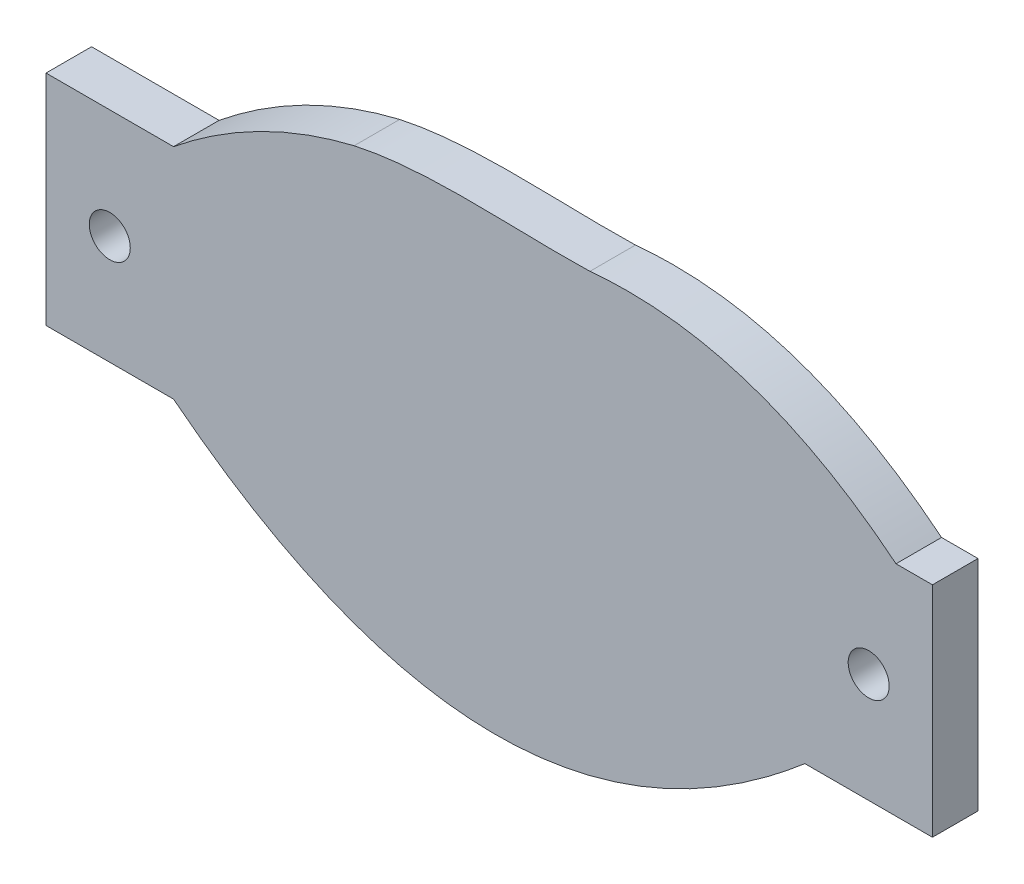
ISO-10303-21;
HEADER;
FILE_DESCRIPTION(('STEP AP214'),'2;1');
FILE_NAME('part.step','',(''),(''),'','','');
FILE_SCHEMA(('AUTOMOTIVE_DESIGN { 1 0 10303 214 1 1 1 1 }'));
ENDSEC;
DATA;
#1=APPLICATION_CONTEXT('core data for automotive mechanical design processes');
#2=APPLICATION_PROTOCOL_DEFINITION('international standard','automotive_design',2000,#1);
#3=PRODUCT_CONTEXT('',#1,'mechanical');
#4=PRODUCT('Part','Part','',(#3));
#5=PRODUCT_RELATED_PRODUCT_CATEGORY('part','',(#4));
#6=PRODUCT_DEFINITION_FORMATION('','',#4);
#7=PRODUCT_DEFINITION_CONTEXT('part definition',#1,'design');
#8=PRODUCT_DEFINITION('design','',#6,#7);
#9=PRODUCT_DEFINITION_SHAPE('','',#8);
#10=(LENGTH_UNIT() NAMED_UNIT(*) SI_UNIT(.MILLI.,.METRE.));
#11=(NAMED_UNIT(*) PLANE_ANGLE_UNIT() SI_UNIT($,.RADIAN.));
#12=(NAMED_UNIT(*) SI_UNIT($,.STERADIAN.) SOLID_ANGLE_UNIT());
#13=UNCERTAINTY_MEASURE_WITH_UNIT(LENGTH_MEASURE(1.E-05),#10,'distance_accuracy_value','');
#14=(GEOMETRIC_REPRESENTATION_CONTEXT(3) GLOBAL_UNCERTAINTY_ASSIGNED_CONTEXT((#13)) GLOBAL_UNIT_ASSIGNED_CONTEXT((#10,
#11,#12)) REPRESENTATION_CONTEXT('',''));
#15=CARTESIAN_POINT('',(0.,0.,0.));
#16=DIRECTION('',(0.,0.,1.));
#17=DIRECTION('',(1.,0.,0.));
#18=AXIS2_PLACEMENT_3D('',#15,#16,#17);
#19=CARTESIAN_POINT('',(42.3737110695465,-26.2176725913239,-5.));
#20=DIRECTION('',(0.,0.,1.));
#21=DIRECTION('',(-1.,0.,0.));
#22=AXIS2_PLACEMENT_3D('',#19,#20,#21);
#23=PLANE('',#22);
#24=DIRECTION('',(0.,-1.,0.));
#25=VECTOR('',#24,1.);
#26=CARTESIAN_POINT('',(-7.,12.,-5.));
#27=LINE('',#26,#25);
#28=CARTESIAN_POINT('',(-7.,12.,-5.));
#29=VERTEX_POINT('',#28);
#30=CARTESIAN_POINT('',(-7.,-12.,-5.));
#31=VERTEX_POINT('',#30);
#32=EDGE_CURVE('E241',#29,#31,#27,.T.);
#33=ORIENTED_EDGE('',*,*,#32,.F.);
#34=DIRECTION('',(-1.,0.,0.));
#35=VECTOR('',#34,1.);
#36=CARTESIAN_POINT('',(7.,12.,-5.));
#37=LINE('',#36,#35);
#38=CARTESIAN_POINT('',(7.,12.,-5.));
#39=VERTEX_POINT('',#38);
#40=EDGE_CURVE('E141',#39,#29,#37,.T.);
#41=ORIENTED_EDGE('',*,*,#40,.F.);
#42=CARTESIAN_POINT('',(26.825,22.,-5.));
#43=CARTESIAN_POINT('',(16.1529989573886,19.4342453643305,-5.));
#44=CARTESIAN_POINT('',(7.,12.,-5.));
#45=B_SPLINE_CURVE_WITH_KNOTS('',2,(#42,#43,#44),.UNSPECIFIED.,.F.,.F.,(3,3),(0.,
0.53349915690995),.UNSPECIFIED.);
#46=CARTESIAN_POINT('',(26.825,22.,-5.));
#47=VERTEX_POINT('',#46);
#48=EDGE_CURVE('E122',#47,#39,#45,.T.);
#49=ORIENTED_EDGE('',*,*,#48,.F.);
#50=CARTESIAN_POINT('',(52.7027533434082,23.,-5.));
#51=CARTESIAN_POINT('',(44.092421980205,22.7789478344238,-5.));
#52=CARTESIAN_POINT('',(35.180728241993,23.8294814554729,-5.));
#53=CARTESIAN_POINT('',(26.825,22.,-5.));
#54=B_SPLINE_CURVE_WITH_KNOTS('',3,(#50,#51,#52,#53),.UNSPECIFIED.,.F.,.F.,(4,4),(0.,
0.489996711552598),.UNSPECIFIED.);
#55=CARTESIAN_POINT('',(52.7027533434082,23.,-5.));
#56=VERTEX_POINT('',#55);
#57=EDGE_CURVE('E132',#56,#47,#54,.T.);
#58=ORIENTED_EDGE('',*,*,#57,.F.);
#59=CARTESIAN_POINT('',(86.3000000000002,12.,-5.));
#60=CARTESIAN_POINT('',(70.621114072104,24.7032963437799,-5.));
#61=CARTESIAN_POINT('',(52.7027533434082,23.,-5.));
#62=B_SPLINE_CURVE_WITH_KNOTS('',2,(#59,#60,#61),.UNSPECIFIED.,.F.,.F.,(3,3),(0.,1.),.UNSPECIFIED.);
#63=CARTESIAN_POINT('',(86.3,12.,-5.));
#64=VERTEX_POINT('',#63);
#65=EDGE_CURVE('E137',#64,#56,#62,.T.);
#66=ORIENTED_EDGE('',*,*,#65,.F.);
#67=DIRECTION('',(-1.,0.,0.));
#68=VECTOR('',#67,1.);
#69=CARTESIAN_POINT('',(90.3,12.,-5.));
#70=LINE('',#69,#68);
#71=CARTESIAN_POINT('',(90.3,12.,-5.));
#72=VERTEX_POINT('',#71);
#73=EDGE_CURVE('E173',#72,#64,#70,.T.);
#74=ORIENTED_EDGE('',*,*,#73,.F.);
#75=DIRECTION('',(0.,1.,0.));
#76=VECTOR('',#75,1.);
#77=CARTESIAN_POINT('',(90.3,12.,-5.));
#78=LINE('',#77,#76);
#79=CARTESIAN_POINT('',(90.3,-12.,-5.));
#80=VERTEX_POINT('',#79);
#81=EDGE_CURVE('E179',#80,#72,#78,.T.);
#82=ORIENTED_EDGE('',*,*,#81,.F.);
#83=DIRECTION('',(1.,0.,0.));
#84=VECTOR('',#83,1.);
#85=CARTESIAN_POINT('',(90.3,-12.,-5.));
#86=LINE('',#85,#84);
#87=CARTESIAN_POINT('',(76.3,-12.,-5.));
#88=VERTEX_POINT('',#87);
#89=EDGE_CURVE('E182',#88,#80,#86,.T.);
#90=ORIENTED_EDGE('',*,*,#89,.F.);
#91=CARTESIAN_POINT('',(7.,-12.,-5.));
#92=CARTESIAN_POINT('',(43.097422139093,-40.4353451826478,-5.));
#93=CARTESIAN_POINT('',(76.3,-12.,-5.));
#94=B_SPLINE_CURVE_WITH_KNOTS('',2,(#91,#92,#93),.UNSPECIFIED.,.F.,.F.,(3,3),(0.,1.),.UNSPECIFIED.);
#95=CARTESIAN_POINT('',(7.,-12.,-5.));
#96=VERTEX_POINT('',#95);
#97=EDGE_CURVE('E185',#96,#88,#94,.T.);
#98=ORIENTED_EDGE('',*,*,#97,.F.);
#99=DIRECTION('',(1.,0.,0.));
#100=VECTOR('',#99,1.);
#101=CARTESIAN_POINT('',(7.,-12.,-5.));
#102=LINE('',#101,#100);
#103=EDGE_CURVE('E191',#31,#96,#102,.T.);
#104=ORIENTED_EDGE('',*,*,#103,.F.);
#105=EDGE_LOOP('',(#33,#41,#49,#58,#66,#74,#82,#90,#98,#104));
#106=FACE_BOUND('',#105,.T.);
#107=CARTESIAN_POINT('',(0.,0.,-5.));
#108=DIRECTION('',(0.,0.,1.));
#109=DIRECTION('',(1.,0.,0.));
#110=AXIS2_PLACEMENT_3D('',#107,#108,#109);
#111=CIRCLE('',#110,2.25);
#112=CARTESIAN_POINT('',(2.25,0.,-5.));
#113=VERTEX_POINT('',#112);
#114=EDGE_CURVE('E236',#113,#113,#111,.T.);
#115=ORIENTED_EDGE('',*,*,#114,.T.);
#116=EDGE_LOOP('',(#115));
#117=FACE_BOUND('',#116,.T.);
#118=CARTESIAN_POINT('',(83.3,0.,-5.));
#119=DIRECTION('',(0.,0.,1.));
#120=DIRECTION('',(1.,0.,0.));
#121=AXIS2_PLACEMENT_3D('',#118,#119,#120);
#122=CIRCLE('',#121,2.25);
#123=CARTESIAN_POINT('',(85.55,0.,-5.));
#124=VERTEX_POINT('',#123);
#125=EDGE_CURVE('E227',#124,#124,#122,.T.);
#126=ORIENTED_EDGE('',*,*,#125,.T.);
#127=EDGE_LOOP('',(#126));
#128=FACE_BOUND('',#127,.T.);
#129=ADVANCED_FACE('F37',(#106,#117,#128),#23,.F.);
#130=CARTESIAN_POINT('',(42.3737110695465,-26.2176725913239,0.));
#131=DIRECTION('',(0.,0.,1.));
#132=DIRECTION('',(-1.,0.,0.));
#133=AXIS2_PLACEMENT_3D('',#130,#131,#132);
#134=PLANE('',#133);
#135=CARTESIAN_POINT('',(0.,0.,0.));
#136=DIRECTION('',(0.,0.,1.));
#137=DIRECTION('',(1.,0.,0.));
#138=AXIS2_PLACEMENT_3D('',#135,#136,#137);
#139=CIRCLE('',#138,2.25);
#140=CARTESIAN_POINT('',(2.25,0.,0.));
#141=VERTEX_POINT('',#140);
#142=EDGE_CURVE('E233',#141,#141,#139,.T.);
#143=ORIENTED_EDGE('',*,*,#142,.F.);
#144=EDGE_LOOP('',(#143));
#145=FACE_BOUND('',#144,.T.);
#146=DIRECTION('',(0.,-1.,0.));
#147=VECTOR('',#146,1.);
#148=CARTESIAN_POINT('',(-7.,12.,0.));
#149=LINE('',#148,#147);
#150=CARTESIAN_POINT('',(-7.,12.,0.));
#151=VERTEX_POINT('',#150);
#152=CARTESIAN_POINT('',(-7.,-12.,0.));
#153=VERTEX_POINT('',#152);
#154=EDGE_CURVE('E239',#151,#153,#149,.T.);
#155=ORIENTED_EDGE('',*,*,#154,.T.);
#156=DIRECTION('',(1.,0.,0.));
#157=VECTOR('',#156,1.);
#158=CARTESIAN_POINT('',(7.,-12.,0.));
#159=LINE('',#158,#157);
#160=CARTESIAN_POINT('',(7.,-12.,0.));
#161=VERTEX_POINT('',#160);
#162=EDGE_CURVE('E264',#153,#161,#159,.T.);
#163=ORIENTED_EDGE('',*,*,#162,.T.);
#164=CARTESIAN_POINT('',(7.,-12.,0.));
#165=CARTESIAN_POINT('',(43.097422139093,-40.4353451826478,0.));
#166=CARTESIAN_POINT('',(76.3,-12.,0.));
#167=B_SPLINE_CURVE_WITH_KNOTS('',2,(#164,#165,#166),.UNSPECIFIED.,.F.,.F.,(3,3),(0.,1.),.UNSPECIFIED.);
#168=CARTESIAN_POINT('',(76.3,-12.,0.));
#169=VERTEX_POINT('',#168);
#170=EDGE_CURVE('E267',#161,#169,#167,.T.);
#171=ORIENTED_EDGE('',*,*,#170,.T.);
#172=DIRECTION('',(1.,0.,0.));
#173=VECTOR('',#172,1.);
#174=CARTESIAN_POINT('',(90.3,-12.,0.));
#175=LINE('',#174,#173);
#176=CARTESIAN_POINT('',(90.3,-12.,0.));
#177=VERTEX_POINT('',#176);
#178=EDGE_CURVE('E270',#169,#177,#175,.T.);
#179=ORIENTED_EDGE('',*,*,#178,.T.);
#180=DIRECTION('',(0.,1.,0.));
#181=VECTOR('',#180,1.);
#182=CARTESIAN_POINT('',(90.3,12.,0.));
#183=LINE('',#182,#181);
#184=CARTESIAN_POINT('',(90.3,12.,0.));
#185=VERTEX_POINT('',#184);
#186=EDGE_CURVE('E280',#177,#185,#183,.T.);
#187=ORIENTED_EDGE('',*,*,#186,.T.);
#188=DIRECTION('',(-1.,0.,0.));
#189=VECTOR('',#188,1.);
#190=CARTESIAN_POINT('',(90.3,12.,0.));
#191=LINE('',#190,#189);
#192=CARTESIAN_POINT('',(86.3,12.,0.));
#193=VERTEX_POINT('',#192);
#194=EDGE_CURVE('E283',#185,#193,#191,.T.);
#195=ORIENTED_EDGE('',*,*,#194,.T.);
#196=CARTESIAN_POINT('',(86.3000000000002,12.,0.));
#197=CARTESIAN_POINT('',(70.621114072104,24.7032963437799,0.));
#198=CARTESIAN_POINT('',(52.7027533434082,23.,0.));
#199=B_SPLINE_CURVE_WITH_KNOTS('',2,(#196,#197,#198),.UNSPECIFIED.,.F.,.F.,(3,3),(0.,1.),.UNSPECIFIED.);
#200=CARTESIAN_POINT('',(52.7027533434082,23.,0.));
#201=VERTEX_POINT('',#200);
#202=EDGE_CURVE('E286',#193,#201,#199,.T.);
#203=ORIENTED_EDGE('',*,*,#202,.T.);
#204=CARTESIAN_POINT('',(52.7027533434082,23.,0.));
#205=CARTESIAN_POINT('',(44.092421980205,22.7789478344238,0.));
#206=CARTESIAN_POINT('',(35.180728241993,23.8294814554729,0.));
#207=CARTESIAN_POINT('',(26.825,22.,0.));
#208=B_SPLINE_CURVE_WITH_KNOTS('',3,(#204,#205,#206,#207),.UNSPECIFIED.,.F.,.F.,(4,4),(0.,
0.489996711552598),.UNSPECIFIED.);
#209=CARTESIAN_POINT('',(26.825,22.,0.));
#210=VERTEX_POINT('',#209);
#211=EDGE_CURVE('E246',#201,#210,#208,.T.);
#212=ORIENTED_EDGE('',*,*,#211,.T.);
#213=CARTESIAN_POINT('',(26.825,22.,0.));
#214=CARTESIAN_POINT('',(16.1529989573886,19.4342453643305,0.));
#215=CARTESIAN_POINT('',(7.,12.,0.));
#216=B_SPLINE_CURVE_WITH_KNOTS('',2,(#213,#214,#215),.UNSPECIFIED.,.F.,.F.,(3,3),(0.,
0.53349915690995),.UNSPECIFIED.);
#217=CARTESIAN_POINT('',(7.,12.,0.));
#218=VERTEX_POINT('',#217);
#219=EDGE_CURVE('E125',#210,#218,#216,.T.);
#220=ORIENTED_EDGE('',*,*,#219,.T.);
#221=DIRECTION('',(-1.,0.,0.));
#222=VECTOR('',#221,1.);
#223=CARTESIAN_POINT('',(7.,12.,0.));
#224=LINE('',#223,#222);
#225=EDGE_CURVE('E242',#218,#151,#224,.T.);
#226=ORIENTED_EDGE('',*,*,#225,.T.);
#227=EDGE_LOOP('',(#155,#163,#171,#179,#187,#195,#203,#212,#220,#226));
#228=FACE_BOUND('',#227,.T.);
#229=CARTESIAN_POINT('',(83.3,0.,0.));
#230=DIRECTION('',(0.,0.,1.));
#231=DIRECTION('',(1.,0.,0.));
#232=AXIS2_PLACEMENT_3D('',#229,#230,#231);
#233=CIRCLE('',#232,2.25);
#234=CARTESIAN_POINT('',(85.55,0.,0.));
#235=VERTEX_POINT('',#234);
#236=EDGE_CURVE('E230',#235,#235,#233,.T.);
#237=ORIENTED_EDGE('',*,*,#236,.F.);
#238=EDGE_LOOP('',(#237));
#239=FACE_BOUND('',#238,.T.);
#240=ADVANCED_FACE('F207',(#145,#228,#239),#134,.T.);
#241=CARTESIAN_POINT('',(-7.,12.,-5.));
#242=DIRECTION('',(1.,0.,0.));
#243=DIRECTION('',(0.,1.,0.));
#244=AXIS2_PLACEMENT_3D('',#241,#242,#243);
#245=PLANE('',#244);
#246=ORIENTED_EDGE('',*,*,#154,.F.);
#247=DIRECTION('',(0.,0.,1.));
#248=VECTOR('',#247,1.);
#249=CARTESIAN_POINT('',(-7.,12.,-5.));
#250=LINE('',#249,#248);
#251=EDGE_CURVE('E54',#29,#151,#250,.T.);
#252=ORIENTED_EDGE('',*,*,#251,.F.);
#253=ORIENTED_EDGE('',*,*,#32,.T.);
#254=DIRECTION('',(0.,0.,1.));
#255=VECTOR('',#254,1.);
#256=CARTESIAN_POINT('',(-7.,-12.,-5.));
#257=LINE('',#256,#255);
#258=EDGE_CURVE('E11',#31,#153,#257,.T.);
#259=ORIENTED_EDGE('',*,*,#258,.T.);
#260=EDGE_LOOP('',(#246,#252,#253,#259));
#261=FACE_BOUND('',#260,.T.);
#262=ADVANCED_FACE('F39',(#261),#245,.F.);
#263=CARTESIAN_POINT('',(7.,-12.,-5.));
#264=DIRECTION('',(0.,1.,0.));
#265=DIRECTION('',(0.,0.,-1.));
#266=AXIS2_PLACEMENT_3D('',#263,#264,#265);
#267=PLANE('',#266);
#268=ORIENTED_EDGE('',*,*,#162,.F.);
#269=ORIENTED_EDGE('',*,*,#258,.F.);
#270=ORIENTED_EDGE('',*,*,#103,.T.);
#271=DIRECTION('',(0.,0.,1.));
#272=VECTOR('',#271,1.);
#273=CARTESIAN_POINT('',(7.,-12.,-5.));
#274=LINE('',#273,#272);
#275=EDGE_CURVE('E46',#96,#161,#274,.T.);
#276=ORIENTED_EDGE('',*,*,#275,.T.);
#277=EDGE_LOOP('',(#268,#269,#270,#276));
#278=FACE_BOUND('',#277,.T.);
#279=ADVANCED_FACE('F201',(#278),#267,.F.);
#280=DIRECTION('',(0.,0.,1.));
#281=VECTOR('',#280,1.);
#282=SURFACE_OF_LINEAR_EXTRUSION('',#94,#281);
#283=ORIENTED_EDGE('',*,*,#170,.F.);
#284=ORIENTED_EDGE('',*,*,#275,.F.);
#285=ORIENTED_EDGE('',*,*,#97,.T.);
#286=DIRECTION('',(0.,0.,1.));
#287=VECTOR('',#286,1.);
#288=CARTESIAN_POINT('',(76.3,-12.,-5.));
#289=LINE('',#288,#287);
#290=EDGE_CURVE('E261',#88,#169,#289,.T.);
#291=ORIENTED_EDGE('',*,*,#290,.T.);
#292=EDGE_LOOP('',(#283,#284,#285,#291));
#293=FACE_BOUND('',#292,.T.);
#294=ADVANCED_FACE('F197',(#293),#282,.T.);
#295=CARTESIAN_POINT('',(90.3,-12.,-5.));
#296=DIRECTION('',(0.,1.,0.));
#297=DIRECTION('',(-1.,0.,0.));
#298=AXIS2_PLACEMENT_3D('',#295,#296,#297);
#299=PLANE('',#298);
#300=ORIENTED_EDGE('',*,*,#178,.F.);
#301=ORIENTED_EDGE('',*,*,#290,.F.);
#302=ORIENTED_EDGE('',*,*,#89,.T.);
#303=DIRECTION('',(0.,0.,1.));
#304=VECTOR('',#303,1.);
#305=CARTESIAN_POINT('',(90.3,-12.,-5.));
#306=LINE('',#305,#304);
#307=EDGE_CURVE('E259',#80,#177,#306,.T.);
#308=ORIENTED_EDGE('',*,*,#307,.T.);
#309=EDGE_LOOP('',(#300,#301,#302,#308));
#310=FACE_BOUND('',#309,.T.);
#311=ADVANCED_FACE('F200',(#310),#299,.F.);
#312=CARTESIAN_POINT('',(90.3,12.,-5.));
#313=DIRECTION('',(-1.,0.,0.));
#314=DIRECTION('',(0.,0.,-1.));
#315=AXIS2_PLACEMENT_3D('',#312,#313,#314);
#316=PLANE('',#315);
#317=ORIENTED_EDGE('',*,*,#186,.F.);
#318=ORIENTED_EDGE('',*,*,#307,.F.);
#319=ORIENTED_EDGE('',*,*,#81,.T.);
#320=DIRECTION('',(0.,0.,1.));
#321=VECTOR('',#320,1.);
#322=CARTESIAN_POINT('',(90.3,12.,-5.));
#323=LINE('',#322,#321);
#324=EDGE_CURVE('E257',#72,#185,#323,.T.);
#325=ORIENTED_EDGE('',*,*,#324,.T.);
#326=EDGE_LOOP('',(#317,#318,#319,#325));
#327=FACE_BOUND('',#326,.T.);
#328=ADVANCED_FACE('F306',(#327),#316,.F.);
#329=CARTESIAN_POINT('',(90.3,12.,-5.));
#330=DIRECTION('',(0.,-1.,0.));
#331=DIRECTION('',(1.,0.,0.));
#332=AXIS2_PLACEMENT_3D('',#329,#330,#331);
#333=PLANE('',#332);
#334=ORIENTED_EDGE('',*,*,#194,.F.);
#335=ORIENTED_EDGE('',*,*,#324,.F.);
#336=ORIENTED_EDGE('',*,*,#73,.T.);
#337=DIRECTION('',(0.,0.,1.));
#338=VECTOR('',#337,1.);
#339=CARTESIAN_POINT('',(86.3,12.,-5.));
#340=LINE('',#339,#338);
#341=EDGE_CURVE('E255',#64,#193,#340,.T.);
#342=ORIENTED_EDGE('',*,*,#341,.T.);
#343=EDGE_LOOP('',(#334,#335,#336,#342));
#344=FACE_BOUND('',#343,.T.);
#345=ADVANCED_FACE('F166',(#344),#333,.F.);
#346=DIRECTION('',(0.,0.,1.));
#347=VECTOR('',#346,1.);
#348=SURFACE_OF_LINEAR_EXTRUSION('',#62,#347);
#349=ORIENTED_EDGE('',*,*,#202,.F.);
#350=ORIENTED_EDGE('',*,*,#341,.F.);
#351=ORIENTED_EDGE('',*,*,#65,.T.);
#352=DIRECTION('',(0.,0.,1.));
#353=VECTOR('',#352,1.);
#354=CARTESIAN_POINT('',(52.7027533434082,23.,-5.));
#355=LINE('',#354,#353);
#356=EDGE_CURVE('E129',#56,#201,#355,.T.);
#357=ORIENTED_EDGE('',*,*,#356,.T.);
#358=EDGE_LOOP('',(#349,#350,#351,#357));
#359=FACE_BOUND('',#358,.T.);
#360=ADVANCED_FACE('F163',(#359),#348,.T.);
#361=DIRECTION('',(0.,0.,1.));
#362=VECTOR('',#361,1.);
#363=SURFACE_OF_LINEAR_EXTRUSION('',#54,#362);
#364=ORIENTED_EDGE('',*,*,#211,.F.);
#365=ORIENTED_EDGE('',*,*,#356,.F.);
#366=ORIENTED_EDGE('',*,*,#57,.T.);
#367=DIRECTION('',(0.,0.,1.));
#368=VECTOR('',#367,1.);
#369=CARTESIAN_POINT('',(26.825,22.,-5.));
#370=LINE('',#369,#368);
#371=EDGE_CURVE('E118',#47,#210,#370,.T.);
#372=ORIENTED_EDGE('',*,*,#371,.T.);
#373=EDGE_LOOP('',(#364,#365,#366,#372));
#374=FACE_BOUND('',#373,.T.);
#375=ADVANCED_FACE('F133',(#374),#363,.T.);
#376=DIRECTION('',(0.,0.,1.));
#377=VECTOR('',#376,1.);
#378=SURFACE_OF_LINEAR_EXTRUSION('',#45,#377);
#379=ORIENTED_EDGE('',*,*,#219,.F.);
#380=ORIENTED_EDGE('',*,*,#371,.F.);
#381=ORIENTED_EDGE('',*,*,#48,.T.);
#382=DIRECTION('',(0.,0.,1.));
#383=VECTOR('',#382,1.);
#384=CARTESIAN_POINT('',(7.,12.,-5.));
#385=LINE('',#384,#383);
#386=EDGE_CURVE('E88',#39,#218,#385,.T.);
#387=ORIENTED_EDGE('',*,*,#386,.T.);
#388=EDGE_LOOP('',(#379,#380,#381,#387));
#389=FACE_BOUND('',#388,.T.);
#390=ADVANCED_FACE('F120',(#389),#378,.T.);
#391=CARTESIAN_POINT('',(7.,12.,-5.));
#392=DIRECTION('',(0.,-1.,0.));
#393=DIRECTION('',(0.,0.,1.));
#394=AXIS2_PLACEMENT_3D('',#391,#392,#393);
#395=PLANE('',#394);
#396=ORIENTED_EDGE('',*,*,#225,.F.);
#397=ORIENTED_EDGE('',*,*,#386,.F.);
#398=ORIENTED_EDGE('',*,*,#40,.T.);
#399=ORIENTED_EDGE('',*,*,#251,.T.);
#400=EDGE_LOOP('',(#396,#397,#398,#399));
#401=FACE_BOUND('',#400,.T.);
#402=ADVANCED_FACE('F159',(#401),#395,.F.);
#403=CARTESIAN_POINT('',(0.,0.,-5.));
#404=DIRECTION('',(0.,0.,1.));
#405=DIRECTION('',(-1.,0.,0.));
#406=AXIS2_PLACEMENT_3D('',#403,#404,#405);
#407=CYLINDRICAL_SURFACE('',#406,2.25);
#408=ORIENTED_EDGE('',*,*,#114,.F.);
#409=EDGE_LOOP('',(#408));
#410=FACE_BOUND('',#409,.T.);
#411=ORIENTED_EDGE('',*,*,#142,.T.);
#412=EDGE_LOOP('',(#411));
#413=FACE_BOUND('',#412,.T.);
#414=ADVANCED_FACE('F215',(#410,#413),#407,.F.);
#415=CARTESIAN_POINT('',(83.3,0.,-5.));
#416=DIRECTION('',(0.,0.,1.));
#417=DIRECTION('',(-1.,0.,0.));
#418=AXIS2_PLACEMENT_3D('',#415,#416,#417);
#419=CYLINDRICAL_SURFACE('',#418,2.25);
#420=ORIENTED_EDGE('',*,*,#125,.F.);
#421=EDGE_LOOP('',(#420));
#422=FACE_BOUND('',#421,.T.);
#423=ORIENTED_EDGE('',*,*,#236,.T.);
#424=EDGE_LOOP('',(#423));
#425=FACE_BOUND('',#424,.T.);
#426=ADVANCED_FACE('F218',(#422,#425),#419,.F.);
#427=CLOSED_SHELL('',(#129,#240,#262,#279,#294,#311,#328,#345,#360,#375,#390,#402,#414,#426));
#428=MANIFOLD_SOLID_BREP('B2',#427);
#429=ADVANCED_BREP_SHAPE_REPRESENTATION('',(#18,#428),#14);
#430=SHAPE_DEFINITION_REPRESENTATION(#9,#429);
ENDSEC;
END-ISO-10303-21;
